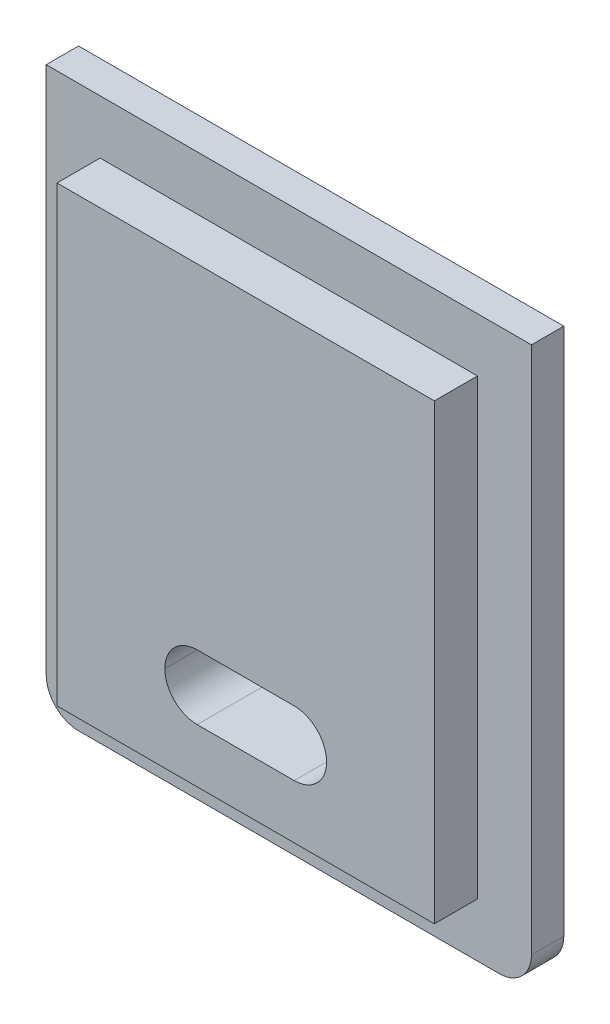
ISO-10303-21;
HEADER;
FILE_DESCRIPTION(('STEP AP214'),'2;1');
FILE_NAME('part.step','',(''),(''),'','','');
FILE_SCHEMA(('AUTOMOTIVE_DESIGN { 1 0 10303 214 1 1 1 1 }'));
ENDSEC;
DATA;
#1=APPLICATION_CONTEXT('core data for automotive mechanical design processes');
#2=APPLICATION_PROTOCOL_DEFINITION('international standard','automotive_design',2000,#1);
#3=PRODUCT_CONTEXT('',#1,'mechanical');
#4=PRODUCT('Part','Part','',(#3));
#5=PRODUCT_RELATED_PRODUCT_CATEGORY('part','',(#4));
#6=PRODUCT_DEFINITION_FORMATION('','',#4);
#7=PRODUCT_DEFINITION_CONTEXT('part definition',#1,'design');
#8=PRODUCT_DEFINITION('design','',#6,#7);
#9=PRODUCT_DEFINITION_SHAPE('','',#8);
#10=(LENGTH_UNIT() NAMED_UNIT(*) SI_UNIT(.MILLI.,.METRE.));
#11=(NAMED_UNIT(*) PLANE_ANGLE_UNIT() SI_UNIT($,.RADIAN.));
#12=(NAMED_UNIT(*) SI_UNIT($,.STERADIAN.) SOLID_ANGLE_UNIT());
#13=UNCERTAINTY_MEASURE_WITH_UNIT(LENGTH_MEASURE(1.E-05),#10,'distance_accuracy_value','');
#14=(GEOMETRIC_REPRESENTATION_CONTEXT(3) GLOBAL_UNCERTAINTY_ASSIGNED_CONTEXT((#13)) GLOBAL_UNIT_ASSIGNED_CONTEXT((#10,
#11,#12)) REPRESENTATION_CONTEXT('',''));
#15=CARTESIAN_POINT('',(0.,0.,0.));
#16=DIRECTION('',(0.,0.,1.));
#17=DIRECTION('',(1.,0.,0.));
#18=AXIS2_PLACEMENT_3D('',#15,#16,#17);
#19=CARTESIAN_POINT('',(0.,0.,3.));
#20=DIRECTION('',(0.,0.,-1.));
#21=DIRECTION('',(-1.,0.,0.));
#22=AXIS2_PLACEMENT_3D('',#19,#20,#21);
#23=PLANE('',#22);
#24=DIRECTION('',(1.,0.,0.));
#25=VECTOR('',#24,1.);
#26=CARTESIAN_POINT('',(0.,0.,3.));
#27=LINE('',#26,#25);
#28=CARTESIAN_POINT('',(3.,0.,3.));
#29=VERTEX_POINT('',#28);
#30=CARTESIAN_POINT('',(42.,0.,3.));
#31=VERTEX_POINT('',#30);
#32=EDGE_CURVE('E197',#29,#31,#27,.T.);
#33=ORIENTED_EDGE('',*,*,#32,.T.);
#34=CARTESIAN_POINT('',(42.,3.,3.));
#35=DIRECTION('',(0.,0.,-1.));
#36=DIRECTION('',(-1.,0.,0.));
#37=AXIS2_PLACEMENT_3D('',#34,#35,#36);
#38=CIRCLE('',#37,3.);
#39=CARTESIAN_POINT('',(45.,3.,3.));
#40=VERTEX_POINT('',#39);
#41=EDGE_CURVE('E258',#31,#40,#38,.F.);
#42=ORIENTED_EDGE('',*,*,#41,.T.);
#43=DIRECTION('',(0.,1.,0.));
#44=VECTOR('',#43,1.);
#45=CARTESIAN_POINT('',(45.,0.,3.));
#46=LINE('',#45,#44);
#47=CARTESIAN_POINT('',(45.,52.,3.));
#48=VERTEX_POINT('',#47);
#49=EDGE_CURVE('E202',#40,#48,#46,.T.);
#50=ORIENTED_EDGE('',*,*,#49,.T.);
#51=DIRECTION('',(-1.,0.,0.));
#52=VECTOR('',#51,1.);
#53=CARTESIAN_POINT('',(0.,52.,3.));
#54=LINE('',#53,#52);
#55=CARTESIAN_POINT('',(0.,52.,3.));
#56=VERTEX_POINT('',#55);
#57=EDGE_CURVE('E205',#48,#56,#54,.T.);
#58=ORIENTED_EDGE('',*,*,#57,.T.);
#59=DIRECTION('',(0.,-1.,0.));
#60=VECTOR('',#59,1.);
#61=CARTESIAN_POINT('',(0.,0.,3.));
#62=LINE('',#61,#60);
#63=CARTESIAN_POINT('',(0.,3.,3.));
#64=VERTEX_POINT('',#63);
#65=EDGE_CURVE('E193',#56,#64,#62,.T.);
#66=ORIENTED_EDGE('',*,*,#65,.T.);
#67=CARTESIAN_POINT('',(3.,3.,3.));
#68=DIRECTION('',(0.,0.,-1.));
#69=DIRECTION('',(-1.,0.,0.));
#70=AXIS2_PLACEMENT_3D('',#67,#68,#69);
#71=CIRCLE('',#70,3.);
#72=EDGE_CURVE('E255',#64,#29,#71,.F.);
#73=ORIENTED_EDGE('',*,*,#72,.T.);
#74=EDGE_LOOP('',(#33,#42,#50,#58,#66,#73));
#75=FACE_BOUND('',#74,.T.);
#76=DIRECTION('',(0.,1.,0.));
#77=VECTOR('',#76,1.);
#78=CARTESIAN_POINT('',(40.,47.0000000000001,3.));
#79=LINE('',#78,#77);
#80=CARTESIAN_POINT('',(40.,5.00000000000006,3.));
#81=VERTEX_POINT('',#80);
#82=CARTESIAN_POINT('',(40.,47.0000000000001,3.));
#83=VERTEX_POINT('',#82);
#84=EDGE_CURVE('E180',#81,#83,#79,.T.);
#85=ORIENTED_EDGE('',*,*,#84,.F.);
#86=DIRECTION('',(1.,0.,0.));
#87=VECTOR('',#86,1.);
#88=CARTESIAN_POINT('',(5.00000000000002,5.00000000000006,3.));
#89=LINE('',#88,#87);
#90=CARTESIAN_POINT('',(5.00000000000002,5.00000000000006,3.));
#91=VERTEX_POINT('',#90);
#92=EDGE_CURVE('E177',#91,#81,#89,.T.);
#93=ORIENTED_EDGE('',*,*,#92,.F.);
#94=DIRECTION('',(0.,-1.,0.));
#95=VECTOR('',#94,1.);
#96=CARTESIAN_POINT('',(5.00000000000001,47.0000000000001,3.));
#97=LINE('',#96,#95);
#98=CARTESIAN_POINT('',(5.00000000000001,47.0000000000001,3.));
#99=VERTEX_POINT('',#98);
#100=EDGE_CURVE('E328',#99,#91,#97,.T.);
#101=ORIENTED_EDGE('',*,*,#100,.F.);
#102=DIRECTION('',(-1.,0.,0.));
#103=VECTOR('',#102,1.);
#104=CARTESIAN_POINT('',(5.00000000000001,47.0000000000001,3.));
#105=LINE('',#104,#103);
#106=EDGE_CURVE('E325',#83,#99,#105,.T.);
#107=ORIENTED_EDGE('',*,*,#106,.F.);
#108=EDGE_LOOP('',(#85,#93,#101,#107));
#109=FACE_BOUND('',#108,.T.);
#110=ADVANCED_FACE('F39',(#75,#109),#23,.F.);
#111=CARTESIAN_POINT('',(0.,0.,3.));
#112=DIRECTION('',(1.,0.,0.));
#113=DIRECTION('',(0.,0.,-1.));
#114=AXIS2_PLACEMENT_3D('',#111,#112,#113);
#115=PLANE('',#114);
#116=DIRECTION('',(0.,-1.,0.));
#117=VECTOR('',#116,1.);
#118=CARTESIAN_POINT('',(0.,0.,0.));
#119=LINE('',#118,#117);
#120=CARTESIAN_POINT('',(0.,52.,0.));
#121=VERTEX_POINT('',#120);
#122=CARTESIAN_POINT('',(0.,3.,0.));
#123=VERTEX_POINT('',#122);
#124=EDGE_CURVE('E182',#121,#123,#119,.T.);
#125=ORIENTED_EDGE('',*,*,#124,.T.);
#126=DIRECTION('',(0.,0.,-1.));
#127=VECTOR('',#126,1.);
#128=CARTESIAN_POINT('',(0.,3.,3.));
#129=LINE('',#128,#127);
#130=EDGE_CURVE('E261',#123,#64,#129,.F.);
#131=ORIENTED_EDGE('',*,*,#130,.T.);
#132=ORIENTED_EDGE('',*,*,#65,.F.);
#133=DIRECTION('',(0.,0.,-1.));
#134=VECTOR('',#133,1.);
#135=CARTESIAN_POINT('',(0.,52.,3.));
#136=LINE('',#135,#134);
#137=EDGE_CURVE('E207',#56,#121,#136,.T.);
#138=ORIENTED_EDGE('',*,*,#137,.T.);
#139=EDGE_LOOP('',(#125,#131,#132,#138));
#140=FACE_BOUND('',#139,.T.);
#141=ADVANCED_FACE('F345',(#140),#115,.F.);
#142=CARTESIAN_POINT('',(0.,0.,3.));
#143=DIRECTION('',(0.,1.,0.));
#144=DIRECTION('',(0.,0.,1.));
#145=AXIS2_PLACEMENT_3D('',#142,#143,#144);
#146=PLANE('',#145);
#147=DIRECTION('',(1.,0.,0.));
#148=VECTOR('',#147,1.);
#149=CARTESIAN_POINT('',(0.,0.,0.));
#150=LINE('',#149,#148);
#151=CARTESIAN_POINT('',(3.,0.,0.));
#152=VERTEX_POINT('',#151);
#153=CARTESIAN_POINT('',(42.,0.,0.));
#154=VERTEX_POINT('',#153);
#155=EDGE_CURVE('E187',#152,#154,#150,.T.);
#156=ORIENTED_EDGE('',*,*,#155,.T.);
#157=DIRECTION('',(0.,0.,-1.));
#158=VECTOR('',#157,1.);
#159=CARTESIAN_POINT('',(42.,0.,3.));
#160=LINE('',#159,#158);
#161=EDGE_CURVE('E252',#154,#31,#160,.F.);
#162=ORIENTED_EDGE('',*,*,#161,.T.);
#163=ORIENTED_EDGE('',*,*,#32,.F.);
#164=DIRECTION('',(0.,0.,-1.));
#165=VECTOR('',#164,1.);
#166=CARTESIAN_POINT('',(3.,0.,3.));
#167=LINE('',#166,#165);
#168=EDGE_CURVE('E248',#29,#152,#167,.T.);
#169=ORIENTED_EDGE('',*,*,#168,.T.);
#170=EDGE_LOOP('',(#156,#162,#163,#169));
#171=FACE_BOUND('',#170,.T.);
#172=ADVANCED_FACE('F351',(#171),#146,.F.);
#173=CARTESIAN_POINT('',(45.,0.,3.));
#174=DIRECTION('',(-1.,0.,0.));
#175=DIRECTION('',(0.,0.,1.));
#176=AXIS2_PLACEMENT_3D('',#173,#174,#175);
#177=PLANE('',#176);
#178=ORIENTED_EDGE('',*,*,#49,.F.);
#179=DIRECTION('',(0.,0.,-1.));
#180=VECTOR('',#179,1.);
#181=CARTESIAN_POINT('',(45.,3.,3.));
#182=LINE('',#181,#180);
#183=CARTESIAN_POINT('',(45.,3.,0.));
#184=VERTEX_POINT('',#183);
#185=EDGE_CURVE('E238',#40,#184,#182,.T.);
#186=ORIENTED_EDGE('',*,*,#185,.T.);
#187=DIRECTION('',(0.,1.,0.));
#188=VECTOR('',#187,1.);
#189=CARTESIAN_POINT('',(45.,0.,0.));
#190=LINE('',#189,#188);
#191=CARTESIAN_POINT('',(45.,52.,0.));
#192=VERTEX_POINT('',#191);
#193=EDGE_CURVE('E212',#184,#192,#190,.T.);
#194=ORIENTED_EDGE('',*,*,#193,.T.);
#195=DIRECTION('',(0.,0.,-1.));
#196=VECTOR('',#195,1.);
#197=CARTESIAN_POINT('',(45.,52.,3.));
#198=LINE('',#197,#196);
#199=EDGE_CURVE('E220',#48,#192,#198,.T.);
#200=ORIENTED_EDGE('',*,*,#199,.F.);
#201=EDGE_LOOP('',(#178,#186,#194,#200));
#202=FACE_BOUND('',#201,.T.);
#203=ADVANCED_FACE('F363',(#202),#177,.F.);
#204=CARTESIAN_POINT('',(0.,52.,3.));
#205=DIRECTION('',(0.,-1.,0.));
#206=DIRECTION('',(0.,0.,-1.));
#207=AXIS2_PLACEMENT_3D('',#204,#205,#206);
#208=PLANE('',#207);
#209=DIRECTION('',(-1.,0.,0.));
#210=VECTOR('',#209,1.);
#211=CARTESIAN_POINT('',(0.,52.,0.));
#212=LINE('',#211,#210);
#213=EDGE_CURVE('E198',#192,#121,#212,.T.);
#214=ORIENTED_EDGE('',*,*,#213,.T.);
#215=ORIENTED_EDGE('',*,*,#137,.F.);
#216=ORIENTED_EDGE('',*,*,#57,.F.);
#217=ORIENTED_EDGE('',*,*,#199,.T.);
#218=EDGE_LOOP('',(#214,#215,#216,#217));
#219=FACE_BOUND('',#218,.T.);
#220=ADVANCED_FACE('F360',(#219),#208,.F.);
#221=CARTESIAN_POINT('',(0.,0.,0.));
#222=DIRECTION('',(0.,0.,-1.));
#223=DIRECTION('',(-1.,0.,0.));
#224=AXIS2_PLACEMENT_3D('',#221,#222,#223);
#225=PLANE('',#224);
#226=DIRECTION('',(-1.,0.,0.));
#227=VECTOR('',#226,1.);
#228=CARTESIAN_POINT('',(15.,16.0000000000001,0.));
#229=LINE('',#228,#227);
#230=CARTESIAN_POINT('',(27.,16.0000000000001,0.));
#231=VERTEX_POINT('',#230);
#232=CARTESIAN_POINT('',(18.,16.0000000000001,0.));
#233=VERTEX_POINT('',#232);
#234=EDGE_CURVE('E314',#231,#233,#229,.T.);
#235=ORIENTED_EDGE('',*,*,#234,.T.);
#236=CARTESIAN_POINT('',(18.,13.0000000000001,0.));
#237=DIRECTION('',(0.,0.,-1.));
#238=DIRECTION('',(-1.,0.,0.));
#239=AXIS2_PLACEMENT_3D('',#236,#237,#238);
#240=CIRCLE('',#239,3.);
#241=CARTESIAN_POINT('',(15.,13.0000000000001,0.));
#242=VERTEX_POINT('',#241);
#243=EDGE_CURVE('E11',#233,#242,#240,.F.);
#244=ORIENTED_EDGE('',*,*,#243,.T.);
#245=CARTESIAN_POINT('',(18.,13.0000000000001,0.));
#246=DIRECTION('',(0.,0.,-1.));
#247=DIRECTION('',(-1.,0.,0.));
#248=AXIS2_PLACEMENT_3D('',#245,#246,#247);
#249=CIRCLE('',#248,3.);
#250=CARTESIAN_POINT('',(18.,10.0000000000001,0.));
#251=VERTEX_POINT('',#250);
#252=EDGE_CURVE('E272',#242,#251,#249,.F.);
#253=ORIENTED_EDGE('',*,*,#252,.T.);
#254=DIRECTION('',(1.,0.,0.));
#255=VECTOR('',#254,1.);
#256=CARTESIAN_POINT('',(15.,10.0000000000001,0.));
#257=LINE('',#256,#255);
#258=CARTESIAN_POINT('',(27.,10.0000000000001,0.));
#259=VERTEX_POINT('',#258);
#260=EDGE_CURVE('E310',#251,#259,#257,.T.);
#261=ORIENTED_EDGE('',*,*,#260,.T.);
#262=CARTESIAN_POINT('',(27.,13.0000000000001,0.));
#263=DIRECTION('',(0.,0.,-1.));
#264=DIRECTION('',(-1.,0.,0.));
#265=AXIS2_PLACEMENT_3D('',#262,#263,#264);
#266=CIRCLE('',#265,3.);
#267=CARTESIAN_POINT('',(30.,13.0000000000001,0.));
#268=VERTEX_POINT('',#267);
#269=EDGE_CURVE('E267',#259,#268,#266,.F.);
#270=ORIENTED_EDGE('',*,*,#269,.T.);
#271=CARTESIAN_POINT('',(27.,13.0000000000001,0.));
#272=DIRECTION('',(0.,0.,-1.));
#273=DIRECTION('',(-1.,0.,0.));
#274=AXIS2_PLACEMENT_3D('',#271,#272,#273);
#275=CIRCLE('',#274,3.);
#276=EDGE_CURVE('E278',#268,#231,#275,.F.);
#277=ORIENTED_EDGE('',*,*,#276,.T.);
#278=EDGE_LOOP('',(#235,#244,#253,#261,#270,#277));
#279=FACE_BOUND('',#278,.T.);
#280=ORIENTED_EDGE('',*,*,#193,.F.);
#281=CARTESIAN_POINT('',(42.,3.,0.));
#282=DIRECTION('',(0.,0.,-1.));
#283=DIRECTION('',(-1.,0.,0.));
#284=AXIS2_PLACEMENT_3D('',#281,#282,#283);
#285=CIRCLE('',#284,3.);
#286=EDGE_CURVE('E245',#184,#154,#285,.T.);
#287=ORIENTED_EDGE('',*,*,#286,.T.);
#288=ORIENTED_EDGE('',*,*,#155,.F.);
#289=CARTESIAN_POINT('',(3.,3.,0.));
#290=DIRECTION('',(0.,0.,-1.));
#291=DIRECTION('',(-1.,0.,0.));
#292=AXIS2_PLACEMENT_3D('',#289,#290,#291);
#293=CIRCLE('',#292,3.);
#294=EDGE_CURVE('E242',#152,#123,#293,.T.);
#295=ORIENTED_EDGE('',*,*,#294,.T.);
#296=ORIENTED_EDGE('',*,*,#124,.F.);
#297=ORIENTED_EDGE('',*,*,#213,.F.);
#298=EDGE_LOOP('',(#280,#287,#288,#295,#296,#297));
#299=FACE_BOUND('',#298,.T.);
#300=ADVANCED_FACE('F357',(#279,#299),#225,.T.);
#301=CARTESIAN_POINT('',(40.,47.0000000000001,7.));
#302=DIRECTION('',(-1.,0.,0.));
#303=DIRECTION('',(0.,-1.,0.));
#304=AXIS2_PLACEMENT_3D('',#301,#302,#303);
#305=PLANE('',#304);
#306=ORIENTED_EDGE('',*,*,#84,.T.);
#307=DIRECTION('',(0.,0.,-1.));
#308=VECTOR('',#307,1.);
#309=CARTESIAN_POINT('',(40.,47.0000000000001,7.));
#310=LINE('',#309,#308);
#311=CARTESIAN_POINT('',(40.,47.0000000000001,7.));
#312=VERTEX_POINT('',#311);
#313=EDGE_CURVE('E159',#312,#83,#310,.T.);
#314=ORIENTED_EDGE('',*,*,#313,.F.);
#315=DIRECTION('',(0.,1.,0.));
#316=VECTOR('',#315,1.);
#317=CARTESIAN_POINT('',(40.,47.0000000000001,7.));
#318=LINE('',#317,#316);
#319=CARTESIAN_POINT('',(40.,5.00000000000006,7.));
#320=VERTEX_POINT('',#319);
#321=EDGE_CURVE('E167',#320,#312,#318,.T.);
#322=ORIENTED_EDGE('',*,*,#321,.F.);
#323=DIRECTION('',(0.,0.,-1.));
#324=VECTOR('',#323,1.);
#325=CARTESIAN_POINT('',(40.,5.00000000000006,7.));
#326=LINE('',#325,#324);
#327=EDGE_CURVE('E322',#320,#81,#326,.T.);
#328=ORIENTED_EDGE('',*,*,#327,.T.);
#329=EDGE_LOOP('',(#306,#314,#322,#328));
#330=FACE_BOUND('',#329,.T.);
#331=ADVANCED_FACE('F179',(#330),#305,.F.);
#332=CARTESIAN_POINT('',(5.00000000000001,47.0000000000001,7.));
#333=DIRECTION('',(0.,-1.,0.));
#334=DIRECTION('',(0.,0.,-1.));
#335=AXIS2_PLACEMENT_3D('',#332,#333,#334);
#336=PLANE('',#335);
#337=ORIENTED_EDGE('',*,*,#106,.T.);
#338=DIRECTION('',(0.,0.,-1.));
#339=VECTOR('',#338,1.);
#340=CARTESIAN_POINT('',(5.00000000000001,47.0000000000001,7.));
#341=LINE('',#340,#339);
#342=CARTESIAN_POINT('',(5.00000000000001,47.0000000000001,7.));
#343=VERTEX_POINT('',#342);
#344=EDGE_CURVE('E162',#343,#99,#341,.T.);
#345=ORIENTED_EDGE('',*,*,#344,.F.);
#346=DIRECTION('',(-1.,0.,0.));
#347=VECTOR('',#346,1.);
#348=CARTESIAN_POINT('',(5.00000000000001,47.0000000000001,7.));
#349=LINE('',#348,#347);
#350=EDGE_CURVE('E154',#312,#343,#349,.T.);
#351=ORIENTED_EDGE('',*,*,#350,.F.);
#352=ORIENTED_EDGE('',*,*,#313,.T.);
#353=EDGE_LOOP('',(#337,#345,#351,#352));
#354=FACE_BOUND('',#353,.T.);
#355=ADVANCED_FACE('F157',(#354),#336,.F.);
#356=CARTESIAN_POINT('',(5.00000000000001,47.0000000000001,7.));
#357=DIRECTION('',(1.,0.,0.));
#358=DIRECTION('',(0.,1.,0.));
#359=AXIS2_PLACEMENT_3D('',#356,#357,#358);
#360=PLANE('',#359);
#361=ORIENTED_EDGE('',*,*,#100,.T.);
#362=DIRECTION('',(0.,0.,-1.));
#363=VECTOR('',#362,1.);
#364=CARTESIAN_POINT('',(5.00000000000002,5.00000000000006,7.));
#365=LINE('',#364,#363);
#366=CARTESIAN_POINT('',(5.00000000000002,5.00000000000006,7.));
#367=VERTEX_POINT('',#366);
#368=EDGE_CURVE('E189',#367,#91,#365,.T.);
#369=ORIENTED_EDGE('',*,*,#368,.F.);
#370=DIRECTION('',(0.,-1.,0.));
#371=VECTOR('',#370,1.);
#372=CARTESIAN_POINT('',(5.00000000000001,47.0000000000001,7.));
#373=LINE('',#372,#371);
#374=EDGE_CURVE('E166',#343,#367,#373,.T.);
#375=ORIENTED_EDGE('',*,*,#374,.F.);
#376=ORIENTED_EDGE('',*,*,#344,.T.);
#377=EDGE_LOOP('',(#361,#369,#375,#376));
#378=FACE_BOUND('',#377,.T.);
#379=ADVANCED_FACE('F342',(#378),#360,.F.);
#380=CARTESIAN_POINT('',(5.00000000000002,5.00000000000006,7.));
#381=DIRECTION('',(0.,1.,0.));
#382=DIRECTION('',(0.,0.,1.));
#383=AXIS2_PLACEMENT_3D('',#380,#381,#382);
#384=PLANE('',#383);
#385=ORIENTED_EDGE('',*,*,#92,.T.);
#386=ORIENTED_EDGE('',*,*,#327,.F.);
#387=DIRECTION('',(1.,0.,0.));
#388=VECTOR('',#387,1.);
#389=CARTESIAN_POINT('',(5.00000000000002,5.00000000000006,7.));
#390=LINE('',#389,#388);
#391=EDGE_CURVE('E172',#367,#320,#390,.T.);
#392=ORIENTED_EDGE('',*,*,#391,.F.);
#393=ORIENTED_EDGE('',*,*,#368,.T.);
#394=EDGE_LOOP('',(#385,#386,#392,#393));
#395=FACE_BOUND('',#394,.T.);
#396=ADVANCED_FACE('F340',(#395),#384,.F.);
#397=CARTESIAN_POINT('',(0.,0.,7.));
#398=DIRECTION('',(0.,0.,1.));
#399=DIRECTION('',(1.,0.,0.));
#400=AXIS2_PLACEMENT_3D('',#397,#398,#399);
#401=PLANE('',#400);
#402=CARTESIAN_POINT('',(18.,13.0000000000001,7.));
#403=DIRECTION('',(0.,0.,1.));
#404=DIRECTION('',(1.,0.,0.));
#405=AXIS2_PLACEMENT_3D('',#402,#403,#404);
#406=CIRCLE('',#405,3.);
#407=CARTESIAN_POINT('',(18.,10.0000000000001,7.));
#408=VERTEX_POINT('',#407);
#409=CARTESIAN_POINT('',(15.,13.0000000000001,7.));
#410=VERTEX_POINT('',#409);
#411=EDGE_CURVE('E63',#408,#410,#406,.F.);
#412=ORIENTED_EDGE('',*,*,#411,.T.);
#413=CARTESIAN_POINT('',(18.,13.0000000000001,7.));
#414=DIRECTION('',(0.,0.,1.));
#415=DIRECTION('',(1.,0.,0.));
#416=AXIS2_PLACEMENT_3D('',#413,#414,#415);
#417=CIRCLE('',#416,3.);
#418=CARTESIAN_POINT('',(18.,16.0000000000001,7.));
#419=VERTEX_POINT('',#418);
#420=EDGE_CURVE('E49',#410,#419,#417,.F.);
#421=ORIENTED_EDGE('',*,*,#420,.T.);
#422=DIRECTION('',(-1.,0.,0.));
#423=VECTOR('',#422,1.);
#424=CARTESIAN_POINT('',(15.,16.0000000000001,7.));
#425=LINE('',#424,#423);
#426=CARTESIAN_POINT('',(27.,16.0000000000001,7.));
#427=VERTEX_POINT('',#426);
#428=EDGE_CURVE('E292',#427,#419,#425,.T.);
#429=ORIENTED_EDGE('',*,*,#428,.F.);
#430=CARTESIAN_POINT('',(27.,13.0000000000001,7.));
#431=DIRECTION('',(0.,0.,1.));
#432=DIRECTION('',(1.,0.,0.));
#433=AXIS2_PLACEMENT_3D('',#430,#431,#432);
#434=CIRCLE('',#433,3.);
#435=CARTESIAN_POINT('',(30.,13.0000000000001,7.));
#436=VERTEX_POINT('',#435);
#437=EDGE_CURVE('E275',#427,#436,#434,.F.);
#438=ORIENTED_EDGE('',*,*,#437,.T.);
#439=CARTESIAN_POINT('',(27.,13.0000000000001,7.));
#440=DIRECTION('',(0.,0.,1.));
#441=DIRECTION('',(1.,0.,0.));
#442=AXIS2_PLACEMENT_3D('',#439,#440,#441);
#443=CIRCLE('',#442,3.);
#444=CARTESIAN_POINT('',(27.,10.0000000000001,7.));
#445=VERTEX_POINT('',#444);
#446=EDGE_CURVE('E264',#436,#445,#443,.F.);
#447=ORIENTED_EDGE('',*,*,#446,.T.);
#448=DIRECTION('',(1.,0.,0.));
#449=VECTOR('',#448,1.);
#450=CARTESIAN_POINT('',(15.,10.0000000000001,7.));
#451=LINE('',#450,#449);
#452=EDGE_CURVE('E285',#408,#445,#451,.T.);
#453=ORIENTED_EDGE('',*,*,#452,.F.);
#454=EDGE_LOOP('',(#412,#421,#429,#438,#447,#453));
#455=FACE_BOUND('',#454,.T.);
#456=ORIENTED_EDGE('',*,*,#321,.T.);
#457=ORIENTED_EDGE('',*,*,#350,.T.);
#458=ORIENTED_EDGE('',*,*,#374,.T.);
#459=ORIENTED_EDGE('',*,*,#391,.T.);
#460=EDGE_LOOP('',(#456,#457,#458,#459));
#461=FACE_BOUND('',#460,.T.);
#462=ADVANCED_FACE('F170',(#455,#461),#401,.T.);
#463=CARTESIAN_POINT('',(15.,16.0000000000001,0.));
#464=DIRECTION('',(0.,1.,0.));
#465=DIRECTION('',(-1.,0.,0.));
#466=AXIS2_PLACEMENT_3D('',#463,#464,#465);
#467=PLANE('',#466);
#468=ORIENTED_EDGE('',*,*,#234,.F.);
#469=DIRECTION('',(0.,0.,1.));
#470=VECTOR('',#469,1.);
#471=CARTESIAN_POINT('',(27.,16.0000000000001,7.));
#472=LINE('',#471,#470);
#473=EDGE_CURVE('E235',#231,#427,#472,.T.);
#474=ORIENTED_EDGE('',*,*,#473,.T.);
#475=ORIENTED_EDGE('',*,*,#428,.T.);
#476=DIRECTION('',(0.,0.,1.));
#477=VECTOR('',#476,1.);
#478=CARTESIAN_POINT('',(18.,16.0000000000001,0.));
#479=LINE('',#478,#477);
#480=EDGE_CURVE('E232',#419,#233,#479,.F.);
#481=ORIENTED_EDGE('',*,*,#480,.T.);
#482=EDGE_LOOP('',(#468,#474,#475,#481));
#483=FACE_BOUND('',#482,.T.);
#484=ADVANCED_FACE('F307',(#483),#467,.F.);
#485=CARTESIAN_POINT('',(15.,10.0000000000001,0.));
#486=DIRECTION('',(0.,-1.,0.));
#487=DIRECTION('',(1.,0.,0.));
#488=AXIS2_PLACEMENT_3D('',#485,#486,#487);
#489=PLANE('',#488);
#490=ORIENTED_EDGE('',*,*,#452,.T.);
#491=DIRECTION('',(0.,0.,1.));
#492=VECTOR('',#491,1.);
#493=CARTESIAN_POINT('',(27.,10.0000000000001,0.));
#494=LINE('',#493,#492);
#495=EDGE_CURVE('E228',#445,#259,#494,.F.);
#496=ORIENTED_EDGE('',*,*,#495,.T.);
#497=ORIENTED_EDGE('',*,*,#260,.F.);
#498=DIRECTION('',(0.,0.,1.));
#499=VECTOR('',#498,1.);
#500=CARTESIAN_POINT('',(18.,10.0000000000001,7.));
#501=LINE('',#500,#499);
#502=EDGE_CURVE('E224',#251,#408,#501,.T.);
#503=ORIENTED_EDGE('',*,*,#502,.T.);
#504=EDGE_LOOP('',(#490,#496,#497,#503));
#505=FACE_BOUND('',#504,.T.);
#506=ADVANCED_FACE('F377',(#505),#489,.F.);
#507=CARTESIAN_POINT('',(27.,13.0000000000001,0.));
#508=DIRECTION('',(0.,0.,-1.));
#509=DIRECTION('',(-1.,0.,0.));
#510=AXIS2_PLACEMENT_3D('',#507,#508,#509);
#511=CYLINDRICAL_SURFACE('',#510,3.);
#512=ORIENTED_EDGE('',*,*,#473,.F.);
#513=ORIENTED_EDGE('',*,*,#276,.F.);
#514=DIRECTION('',(0.,0.,1.));
#515=VECTOR('',#514,1.);
#516=CARTESIAN_POINT('',(30.,13.0000000000001,0.));
#517=LINE('',#516,#515);
#518=EDGE_CURVE('E282',#436,#268,#517,.F.);
#519=ORIENTED_EDGE('',*,*,#518,.F.);
#520=ORIENTED_EDGE('',*,*,#437,.F.);
#521=EDGE_LOOP('',(#512,#513,#519,#520));
#522=FACE_BOUND('',#521,.T.);
#523=ADVANCED_FACE('F374',(#522),#511,.F.);
#524=CARTESIAN_POINT('',(27.,13.0000000000001,0.));
#525=DIRECTION('',(0.,0.,-1.));
#526=DIRECTION('',(-1.,0.,0.));
#527=AXIS2_PLACEMENT_3D('',#524,#525,#526);
#528=CYLINDRICAL_SURFACE('',#527,3.);
#529=ORIENTED_EDGE('',*,*,#269,.F.);
#530=ORIENTED_EDGE('',*,*,#495,.F.);
#531=ORIENTED_EDGE('',*,*,#446,.F.);
#532=ORIENTED_EDGE('',*,*,#518,.T.);
#533=EDGE_LOOP('',(#529,#530,#531,#532));
#534=FACE_BOUND('',#533,.T.);
#535=ADVANCED_FACE('F371',(#534),#528,.F.);
#536=CARTESIAN_POINT('',(18.,13.0000000000001,0.));
#537=DIRECTION('',(0.,0.,-1.));
#538=DIRECTION('',(-1.,0.,0.));
#539=AXIS2_PLACEMENT_3D('',#536,#537,#538);
#540=CYLINDRICAL_SURFACE('',#539,3.);
#541=DIRECTION('',(0.,0.,1.));
#542=VECTOR('',#541,1.);
#543=CARTESIAN_POINT('',(15.,13.0000000000001,7.));
#544=LINE('',#543,#542);
#545=EDGE_CURVE('E43',#242,#410,#544,.T.);
#546=ORIENTED_EDGE('',*,*,#545,.F.);
#547=ORIENTED_EDGE('',*,*,#243,.F.);
#548=ORIENTED_EDGE('',*,*,#480,.F.);
#549=ORIENTED_EDGE('',*,*,#420,.F.);
#550=EDGE_LOOP('',(#546,#547,#548,#549));
#551=FACE_BOUND('',#550,.T.);
#552=ADVANCED_FACE('F300',(#551),#540,.F.);
#553=CARTESIAN_POINT('',(18.,13.0000000000001,0.));
#554=DIRECTION('',(0.,0.,-1.));
#555=DIRECTION('',(-1.,0.,0.));
#556=AXIS2_PLACEMENT_3D('',#553,#554,#555);
#557=CYLINDRICAL_SURFACE('',#556,3.);
#558=ORIENTED_EDGE('',*,*,#252,.F.);
#559=ORIENTED_EDGE('',*,*,#545,.T.);
#560=ORIENTED_EDGE('',*,*,#411,.F.);
#561=ORIENTED_EDGE('',*,*,#502,.F.);
#562=EDGE_LOOP('',(#558,#559,#560,#561));
#563=FACE_BOUND('',#562,.T.);
#564=ADVANCED_FACE('F297',(#563),#557,.F.);
#565=CARTESIAN_POINT('',(42.,3.,3.));
#566=DIRECTION('',(0.,0.,-1.));
#567=DIRECTION('',(-1.,0.,0.));
#568=AXIS2_PLACEMENT_3D('',#565,#566,#567);
#569=CYLINDRICAL_SURFACE('',#568,3.);
#570=ORIENTED_EDGE('',*,*,#41,.F.);
#571=ORIENTED_EDGE('',*,*,#161,.F.);
#572=ORIENTED_EDGE('',*,*,#286,.F.);
#573=ORIENTED_EDGE('',*,*,#185,.F.);
#574=EDGE_LOOP('',(#570,#571,#572,#573));
#575=FACE_BOUND('',#574,.T.);
#576=ADVANCED_FACE('F381',(#575),#569,.T.);
#577=CARTESIAN_POINT('',(3.,3.,3.));
#578=DIRECTION('',(0.,0.,-1.));
#579=DIRECTION('',(-1.,0.,0.));
#580=AXIS2_PLACEMENT_3D('',#577,#578,#579);
#581=CYLINDRICAL_SURFACE('',#580,3.);
#582=ORIENTED_EDGE('',*,*,#72,.F.);
#583=ORIENTED_EDGE('',*,*,#130,.F.);
#584=ORIENTED_EDGE('',*,*,#294,.F.);
#585=ORIENTED_EDGE('',*,*,#168,.F.);
#586=EDGE_LOOP('',(#582,#583,#584,#585));
#587=FACE_BOUND('',#586,.T.);
#588=ADVANCED_FACE('F41',(#587),#581,.T.);
#589=CLOSED_SHELL('',(#110,#141,#172,#203,#220,#300,#331,#355,#379,#396,#462,#484,#506,#523,
#535,#552,#564,#576,#588));
#590=MANIFOLD_SOLID_BREP('B2',#589);
#591=ADVANCED_BREP_SHAPE_REPRESENTATION('',(#18,#590),#14);
#592=SHAPE_DEFINITION_REPRESENTATION(#9,#591);
ENDSEC;
END-ISO-10303-21;
